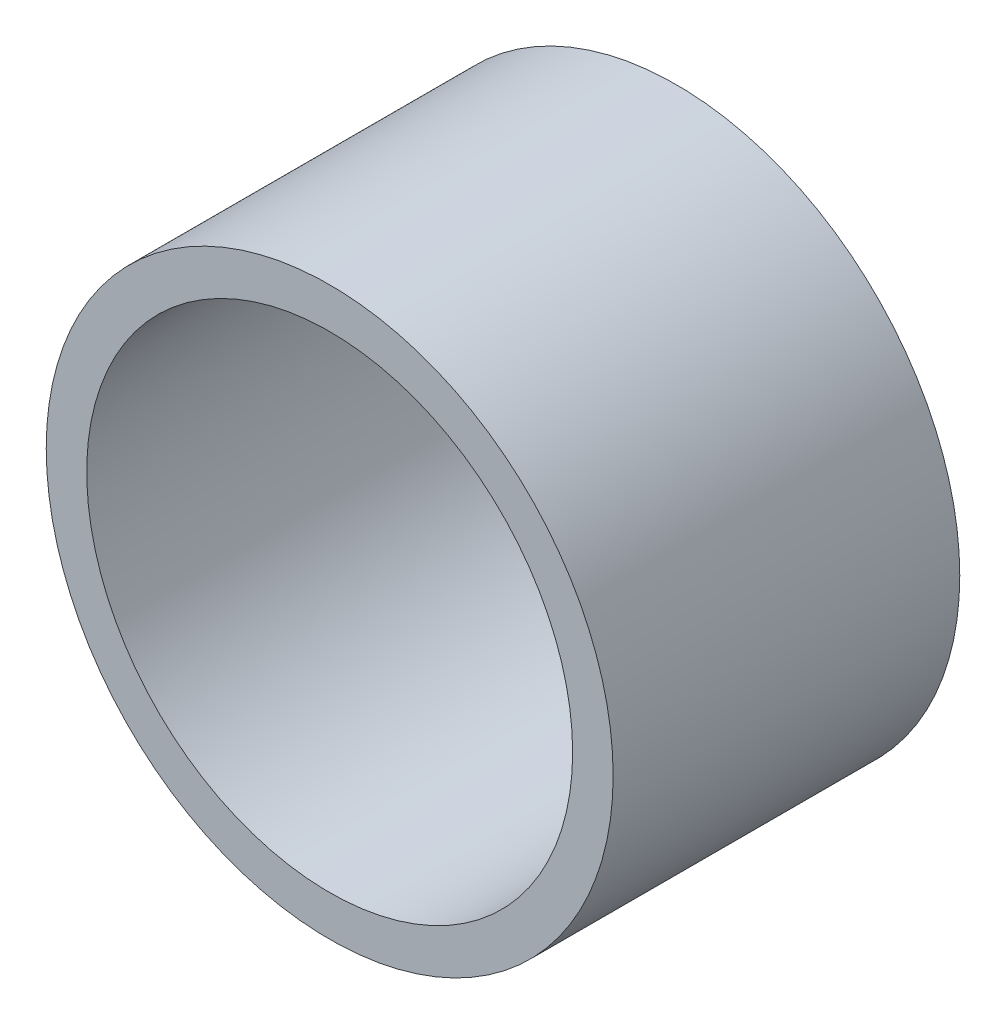
ISO-10303-21;
HEADER;
FILE_DESCRIPTION(('STEP AP214'),'2;1');
FILE_NAME('part.step','',(''),(''),'','','');
FILE_SCHEMA(('AUTOMOTIVE_DESIGN { 1 0 10303 214 1 1 1 1 }'));
ENDSEC;
DATA;
#1=APPLICATION_CONTEXT('core data for automotive mechanical design processes');
#2=APPLICATION_PROTOCOL_DEFINITION('international standard','automotive_design',2000,#1);
#3=PRODUCT_CONTEXT('',#1,'mechanical');
#4=PRODUCT('Part','Part','',(#3));
#5=PRODUCT_RELATED_PRODUCT_CATEGORY('part','',(#4));
#6=PRODUCT_DEFINITION_FORMATION('','',#4);
#7=PRODUCT_DEFINITION_CONTEXT('part definition',#1,'design');
#8=PRODUCT_DEFINITION('design','',#6,#7);
#9=PRODUCT_DEFINITION_SHAPE('','',#8);
#10=(LENGTH_UNIT() NAMED_UNIT(*) SI_UNIT(.MILLI.,.METRE.));
#11=(NAMED_UNIT(*) PLANE_ANGLE_UNIT() SI_UNIT($,.RADIAN.));
#12=(NAMED_UNIT(*) SI_UNIT($,.STERADIAN.) SOLID_ANGLE_UNIT());
#13=UNCERTAINTY_MEASURE_WITH_UNIT(LENGTH_MEASURE(1.E-05),#10,'distance_accuracy_value','');
#14=(GEOMETRIC_REPRESENTATION_CONTEXT(3) GLOBAL_UNCERTAINTY_ASSIGNED_CONTEXT((#13)) GLOBAL_UNIT_ASSIGNED_CONTEXT((#10,
#11,#12)) REPRESENTATION_CONTEXT('',''));
#15=CARTESIAN_POINT('',(0.,0.,0.));
#16=DIRECTION('',(0.,0.,1.));
#17=DIRECTION('',(1.,0.,0.));
#18=AXIS2_PLACEMENT_3D('',#15,#16,#17);
#19=CARTESIAN_POINT('',(0.,0.,13.589));
#20=DIRECTION('',(0.,0.,1.));
#21=DIRECTION('',(1.,0.,0.));
#22=AXIS2_PLACEMENT_3D('',#19,#20,#21);
#23=PLANE('',#22);
#24=CARTESIAN_POINT('',(0.,0.,13.589));
#25=DIRECTION('',(0.,0.,1.));
#26=DIRECTION('',(1.,0.,0.));
#27=AXIS2_PLACEMENT_3D('',#24,#25,#26);
#28=CIRCLE('',#27,11.1125);
#29=CARTESIAN_POINT('',(11.1125,0.,13.589));
#30=VERTEX_POINT('',#29);
#31=EDGE_CURVE('E10',#30,#30,#28,.T.);
#32=ORIENTED_EDGE('',*,*,#31,.T.);
#33=EDGE_LOOP('',(#32));
#34=FACE_BOUND('',#33,.T.);
#35=CARTESIAN_POINT('',(0.,0.,13.589));
#36=DIRECTION('',(0.,0.,1.));
#37=DIRECTION('',(1.,0.,0.));
#38=AXIS2_PLACEMENT_3D('',#35,#36,#37);
#39=CIRCLE('',#38,9.525);
#40=CARTESIAN_POINT('',(9.525,0.,13.589));
#41=VERTEX_POINT('',#40);
#42=EDGE_CURVE('E57',#41,#41,#39,.T.);
#43=ORIENTED_EDGE('',*,*,#42,.F.);
#44=EDGE_LOOP('',(#43));
#45=FACE_BOUND('',#44,.T.);
#46=ADVANCED_FACE('F41',(#34,#45),#23,.T.);
#47=CARTESIAN_POINT('',(0.,0.,0.));
#48=DIRECTION('',(0.,0.,1.));
#49=DIRECTION('',(1.,0.,0.));
#50=AXIS2_PLACEMENT_3D('',#47,#48,#49);
#51=PLANE('',#50);
#52=CARTESIAN_POINT('',(0.,0.,0.));
#53=DIRECTION('',(0.,0.,1.));
#54=DIRECTION('',(1.,0.,0.));
#55=AXIS2_PLACEMENT_3D('',#52,#53,#54);
#56=CIRCLE('',#55,11.1125);
#57=CARTESIAN_POINT('',(11.1125,0.,0.));
#58=VERTEX_POINT('',#57);
#59=EDGE_CURVE('E45',#58,#58,#56,.T.);
#60=ORIENTED_EDGE('',*,*,#59,.F.);
#61=EDGE_LOOP('',(#60));
#62=FACE_BOUND('',#61,.T.);
#63=CARTESIAN_POINT('',(0.,0.,0.));
#64=DIRECTION('',(0.,0.,1.));
#65=DIRECTION('',(1.,0.,0.));
#66=AXIS2_PLACEMENT_3D('',#63,#64,#65);
#67=CIRCLE('',#66,9.525);
#68=CARTESIAN_POINT('',(9.525,0.,0.));
#69=VERTEX_POINT('',#68);
#70=EDGE_CURVE('E59',#69,#69,#67,.T.);
#71=ORIENTED_EDGE('',*,*,#70,.T.);
#72=EDGE_LOOP('',(#71));
#73=FACE_BOUND('',#72,.T.);
#74=ADVANCED_FACE('F70',(#62,#73),#51,.F.);
#75=CARTESIAN_POINT('',(0.,0.,13.589));
#76=DIRECTION('',(0.,0.,-1.));
#77=DIRECTION('',(-1.,0.,0.));
#78=AXIS2_PLACEMENT_3D('',#75,#76,#77);
#79=CYLINDRICAL_SURFACE('',#78,11.1125);
#80=ORIENTED_EDGE('',*,*,#31,.F.);
#81=EDGE_LOOP('',(#80));
#82=FACE_BOUND('',#81,.T.);
#83=ORIENTED_EDGE('',*,*,#59,.T.);
#84=EDGE_LOOP('',(#83));
#85=FACE_BOUND('',#84,.T.);
#86=ADVANCED_FACE('F43',(#82,#85),#79,.T.);
#87=CARTESIAN_POINT('',(0.,0.,13.589));
#88=DIRECTION('',(0.,0.,-1.));
#89=DIRECTION('',(-1.,0.,0.));
#90=AXIS2_PLACEMENT_3D('',#87,#88,#89);
#91=CYLINDRICAL_SURFACE('',#90,9.525);
#92=ORIENTED_EDGE('',*,*,#42,.T.);
#93=EDGE_LOOP('',(#92));
#94=FACE_BOUND('',#93,.T.);
#95=ORIENTED_EDGE('',*,*,#70,.F.);
#96=EDGE_LOOP('',(#95));
#97=FACE_BOUND('',#96,.T.);
#98=ADVANCED_FACE('F66',(#94,#97),#91,.F.);
#99=CLOSED_SHELL('',(#46,#74,#86,#98));
#100=MANIFOLD_SOLID_BREP('B2',#99);
#101=ADVANCED_BREP_SHAPE_REPRESENTATION('',(#18,#100),#14);
#102=SHAPE_DEFINITION_REPRESENTATION(#9,#101);
ENDSEC;
END-ISO-10303-21;
